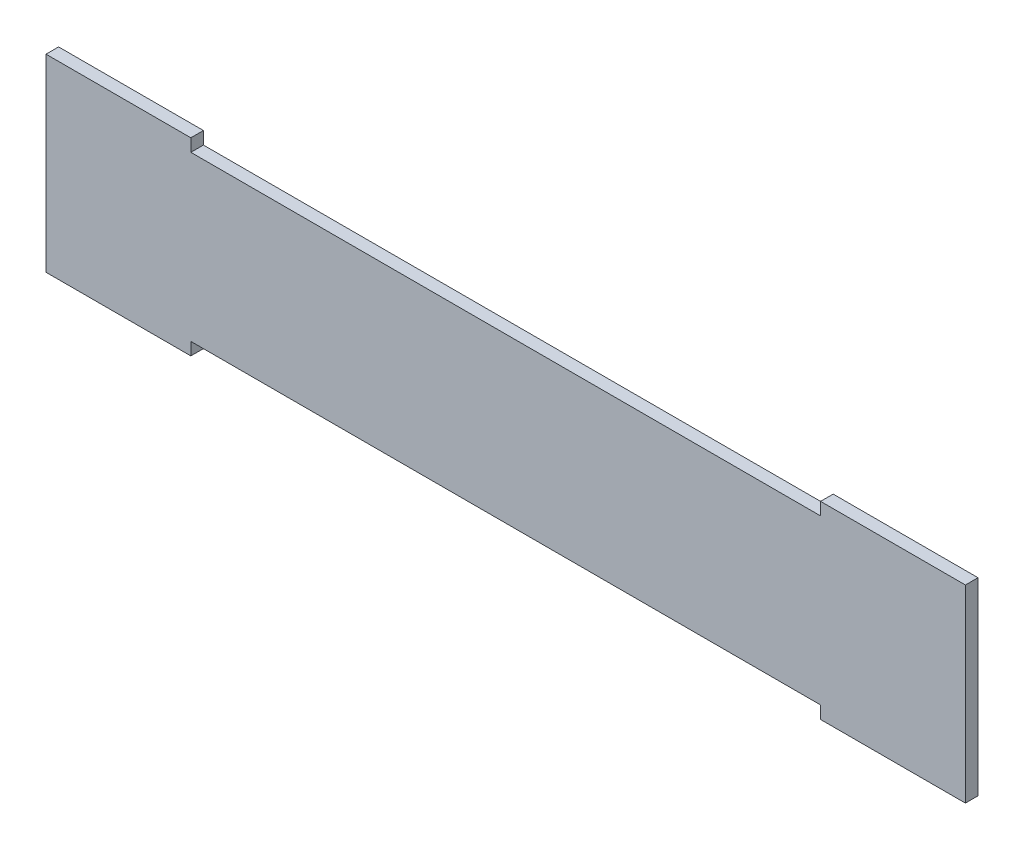
ISO-10303-21;
HEADER;
FILE_DESCRIPTION(('STEP AP214'),'2;1');
FILE_NAME('part.step','',(''),(''),'','','');
FILE_SCHEMA(('AUTOMOTIVE_DESIGN { 1 0 10303 214 1 1 1 1 }'));
ENDSEC;
DATA;
#1=APPLICATION_CONTEXT('core data for automotive mechanical design processes');
#2=APPLICATION_PROTOCOL_DEFINITION('international standard','automotive_design',2000,#1);
#3=PRODUCT_CONTEXT('',#1,'mechanical');
#4=PRODUCT('Part','Part','',(#3));
#5=PRODUCT_RELATED_PRODUCT_CATEGORY('part','',(#4));
#6=PRODUCT_DEFINITION_FORMATION('','',#4);
#7=PRODUCT_DEFINITION_CONTEXT('part definition',#1,'design');
#8=PRODUCT_DEFINITION('design','',#6,#7);
#9=PRODUCT_DEFINITION_SHAPE('','',#8);
#10=(LENGTH_UNIT() NAMED_UNIT(*) SI_UNIT(.MILLI.,.METRE.));
#11=(NAMED_UNIT(*) PLANE_ANGLE_UNIT() SI_UNIT($,.RADIAN.));
#12=(NAMED_UNIT(*) SI_UNIT($,.STERADIAN.) SOLID_ANGLE_UNIT());
#13=UNCERTAINTY_MEASURE_WITH_UNIT(LENGTH_MEASURE(1.E-05),#10,'distance_accuracy_value','');
#14=(GEOMETRIC_REPRESENTATION_CONTEXT(3) GLOBAL_UNCERTAINTY_ASSIGNED_CONTEXT((#13)) GLOBAL_UNIT_ASSIGNED_CONTEXT((#10,
#11,#12)) REPRESENTATION_CONTEXT('',''));
#15=CARTESIAN_POINT('',(0.,0.,0.));
#16=DIRECTION('',(0.,0.,1.));
#17=DIRECTION('',(1.,0.,0.));
#18=AXIS2_PLACEMENT_3D('',#15,#16,#17);
#19=CARTESIAN_POINT('',(0.,0.,2.));
#20=DIRECTION('',(1.,0.,0.));
#21=DIRECTION('',(0.,1.,0.));
#22=AXIS2_PLACEMENT_3D('',#19,#20,#21);
#23=PLANE('',#22);
#24=DIRECTION('',(0.,-1.,0.));
#25=VECTOR('',#24,1.);
#26=CARTESIAN_POINT('',(0.,0.,0.));
#27=LINE('',#26,#25);
#28=CARTESIAN_POINT('',(0.,15.,0.));
#29=VERTEX_POINT('',#28);
#30=CARTESIAN_POINT('',(0.,-15.,0.));
#31=VERTEX_POINT('',#30);
#32=EDGE_CURVE('E136',#29,#31,#27,.T.);
#33=ORIENTED_EDGE('',*,*,#32,.T.);
#34=DIRECTION('',(0.,0.,-1.));
#35=VECTOR('',#34,1.);
#36=CARTESIAN_POINT('',(0.,-15.,2.));
#37=LINE('',#36,#35);
#38=CARTESIAN_POINT('',(0.,-15.,2.));
#39=VERTEX_POINT('',#38);
#40=EDGE_CURVE('E11',#39,#31,#37,.T.);
#41=ORIENTED_EDGE('',*,*,#40,.F.);
#42=DIRECTION('',(0.,-1.,0.));
#43=VECTOR('',#42,1.);
#44=CARTESIAN_POINT('',(0.,0.,2.));
#45=LINE('',#44,#43);
#46=CARTESIAN_POINT('',(0.,15.,2.));
#47=VERTEX_POINT('',#46);
#48=EDGE_CURVE('E94',#47,#39,#45,.T.);
#49=ORIENTED_EDGE('',*,*,#48,.F.);
#50=DIRECTION('',(0.,0.,-1.));
#51=VECTOR('',#50,1.);
#52=CARTESIAN_POINT('',(0.,15.,2.));
#53=LINE('',#52,#51);
#54=EDGE_CURVE('E211',#47,#29,#53,.T.);
#55=ORIENTED_EDGE('',*,*,#54,.T.);
#56=EDGE_LOOP('',(#33,#41,#49,#55));
#57=FACE_BOUND('',#56,.T.);
#58=ADVANCED_FACE('F39',(#57),#23,.F.);
#59=CARTESIAN_POINT('',(0.,-15.,2.));
#60=DIRECTION('',(0.,1.,0.));
#61=DIRECTION('',(0.,0.,1.));
#62=AXIS2_PLACEMENT_3D('',#59,#60,#61);
#63=PLANE('',#62);
#64=DIRECTION('',(1.,0.,0.));
#65=VECTOR('',#64,1.);
#66=CARTESIAN_POINT('',(0.,-15.,0.));
#67=LINE('',#66,#65);
#68=CARTESIAN_POINT('',(23.,-15.,0.));
#69=VERTEX_POINT('',#68);
#70=EDGE_CURVE('E139',#31,#69,#67,.T.);
#71=ORIENTED_EDGE('',*,*,#70,.T.);
#72=DIRECTION('',(0.,0.,-1.));
#73=VECTOR('',#72,1.);
#74=CARTESIAN_POINT('',(23.,-15.,2.));
#75=LINE('',#74,#73);
#76=CARTESIAN_POINT('',(23.,-15.,2.));
#77=VERTEX_POINT('',#76);
#78=EDGE_CURVE('E48',#77,#69,#75,.T.);
#79=ORIENTED_EDGE('',*,*,#78,.F.);
#80=DIRECTION('',(1.,0.,0.));
#81=VECTOR('',#80,1.);
#82=CARTESIAN_POINT('',(0.,-15.,2.));
#83=LINE('',#82,#81);
#84=EDGE_CURVE('E204',#39,#77,#83,.T.);
#85=ORIENTED_EDGE('',*,*,#84,.F.);
#86=ORIENTED_EDGE('',*,*,#40,.T.);
#87=EDGE_LOOP('',(#71,#79,#85,#86));
#88=FACE_BOUND('',#87,.T.);
#89=ADVANCED_FACE('F207',(#88),#63,.F.);
#90=CARTESIAN_POINT('',(23.,-15.,2.));
#91=DIRECTION('',(-1.,0.,0.));
#92=DIRECTION('',(0.,0.,1.));
#93=AXIS2_PLACEMENT_3D('',#90,#91,#92);
#94=PLANE('',#93);
#95=DIRECTION('',(0.,1.,0.));
#96=VECTOR('',#95,1.);
#97=CARTESIAN_POINT('',(23.,-15.,0.));
#98=LINE('',#97,#96);
#99=CARTESIAN_POINT('',(23.,-13.,0.));
#100=VERTEX_POINT('',#99);
#101=EDGE_CURVE('E143',#69,#100,#98,.T.);
#102=ORIENTED_EDGE('',*,*,#101,.T.);
#103=DIRECTION('',(0.,0.,-1.));
#104=VECTOR('',#103,1.);
#105=CARTESIAN_POINT('',(23.,-13.,2.));
#106=LINE('',#105,#104);
#107=CARTESIAN_POINT('',(23.,-13.,2.));
#108=VERTEX_POINT('',#107);
#109=EDGE_CURVE('E122',#108,#100,#106,.T.);
#110=ORIENTED_EDGE('',*,*,#109,.F.);
#111=DIRECTION('',(0.,1.,0.));
#112=VECTOR('',#111,1.);
#113=CARTESIAN_POINT('',(23.,-15.,2.));
#114=LINE('',#113,#112);
#115=EDGE_CURVE('E111',#77,#108,#114,.T.);
#116=ORIENTED_EDGE('',*,*,#115,.F.);
#117=ORIENTED_EDGE('',*,*,#78,.T.);
#118=EDGE_LOOP('',(#102,#110,#116,#117));
#119=FACE_BOUND('',#118,.T.);
#120=ADVANCED_FACE('F166',(#119),#94,.F.);
#121=CARTESIAN_POINT('',(23.,-13.,2.));
#122=DIRECTION('',(0.,1.,0.));
#123=DIRECTION('',(0.,0.,1.));
#124=AXIS2_PLACEMENT_3D('',#121,#122,#123);
#125=PLANE('',#124);
#126=DIRECTION('',(1.,0.,0.));
#127=VECTOR('',#126,1.);
#128=CARTESIAN_POINT('',(23.,-13.,0.));
#129=LINE('',#128,#127);
#130=CARTESIAN_POINT('',(123.,-13.,0.));
#131=VERTEX_POINT('',#130);
#132=EDGE_CURVE('E120',#100,#131,#129,.T.);
#133=ORIENTED_EDGE('',*,*,#132,.T.);
#134=DIRECTION('',(0.,0.,-1.));
#135=VECTOR('',#134,1.);
#136=CARTESIAN_POINT('',(123.,-13.,2.));
#137=LINE('',#136,#135);
#138=CARTESIAN_POINT('',(123.,-13.,2.));
#139=VERTEX_POINT('',#138);
#140=EDGE_CURVE('E117',#139,#131,#137,.T.);
#141=ORIENTED_EDGE('',*,*,#140,.F.);
#142=DIRECTION('',(1.,0.,0.));
#143=VECTOR('',#142,1.);
#144=CARTESIAN_POINT('',(23.,-13.,2.));
#145=LINE('',#144,#143);
#146=EDGE_CURVE('E105',#108,#139,#145,.T.);
#147=ORIENTED_EDGE('',*,*,#146,.F.);
#148=ORIENTED_EDGE('',*,*,#109,.T.);
#149=EDGE_LOOP('',(#133,#141,#147,#148));
#150=FACE_BOUND('',#149,.T.);
#151=ADVANCED_FACE('F118',(#150),#125,.F.);
#152=CARTESIAN_POINT('',(123.,-13.,2.));
#153=DIRECTION('',(1.,0.,0.));
#154=DIRECTION('',(0.,0.,-1.));
#155=AXIS2_PLACEMENT_3D('',#152,#153,#154);
#156=PLANE('',#155);
#157=DIRECTION('',(0.,-1.,0.));
#158=VECTOR('',#157,1.);
#159=CARTESIAN_POINT('',(123.,-13.,0.));
#160=LINE('',#159,#158);
#161=CARTESIAN_POINT('',(123.,-15.,0.));
#162=VERTEX_POINT('',#161);
#163=EDGE_CURVE('E80',#131,#162,#160,.T.);
#164=ORIENTED_EDGE('',*,*,#163,.T.);
#165=DIRECTION('',(0.,0.,-1.));
#166=VECTOR('',#165,1.);
#167=CARTESIAN_POINT('',(123.,-15.,2.));
#168=LINE('',#167,#166);
#169=CARTESIAN_POINT('',(123.,-15.,2.));
#170=VERTEX_POINT('',#169);
#171=EDGE_CURVE('E123',#170,#162,#168,.T.);
#172=ORIENTED_EDGE('',*,*,#171,.F.);
#173=DIRECTION('',(0.,-1.,0.));
#174=VECTOR('',#173,1.);
#175=CARTESIAN_POINT('',(123.,-13.,2.));
#176=LINE('',#175,#174);
#177=EDGE_CURVE('E109',#139,#170,#176,.T.);
#178=ORIENTED_EDGE('',*,*,#177,.F.);
#179=ORIENTED_EDGE('',*,*,#140,.T.);
#180=EDGE_LOOP('',(#164,#172,#178,#179));
#181=FACE_BOUND('',#180,.T.);
#182=ADVANCED_FACE('F125',(#181),#156,.F.);
#183=CARTESIAN_POINT('',(123.,-15.,2.));
#184=DIRECTION('',(0.,1.,0.));
#185=DIRECTION('',(0.,0.,1.));
#186=AXIS2_PLACEMENT_3D('',#183,#184,#185);
#187=PLANE('',#186);
#188=DIRECTION('',(1.,0.,0.));
#189=VECTOR('',#188,1.);
#190=CARTESIAN_POINT('',(123.,-15.,0.));
#191=LINE('',#190,#189);
#192=CARTESIAN_POINT('',(146.,-15.,0.));
#193=VERTEX_POINT('',#192);
#194=EDGE_CURVE('E86',#162,#193,#191,.T.);
#195=ORIENTED_EDGE('',*,*,#194,.T.);
#196=DIRECTION('',(0.,0.,-1.));
#197=VECTOR('',#196,1.);
#198=CARTESIAN_POINT('',(146.,-15.,2.));
#199=LINE('',#198,#197);
#200=CARTESIAN_POINT('',(146.,-15.,2.));
#201=VERTEX_POINT('',#200);
#202=EDGE_CURVE('E135',#201,#193,#199,.T.);
#203=ORIENTED_EDGE('',*,*,#202,.F.);
#204=DIRECTION('',(1.,0.,0.));
#205=VECTOR('',#204,1.);
#206=CARTESIAN_POINT('',(123.,-15.,2.));
#207=LINE('',#206,#205);
#208=EDGE_CURVE('E56',#170,#201,#207,.T.);
#209=ORIENTED_EDGE('',*,*,#208,.F.);
#210=ORIENTED_EDGE('',*,*,#171,.T.);
#211=EDGE_LOOP('',(#195,#203,#209,#210));
#212=FACE_BOUND('',#211,.T.);
#213=ADVANCED_FACE('F312',(#212),#187,.F.);
#214=CARTESIAN_POINT('',(146.,-15.,2.));
#215=DIRECTION('',(-1.,0.,0.));
#216=DIRECTION('',(0.,-1.,0.));
#217=AXIS2_PLACEMENT_3D('',#214,#215,#216);
#218=PLANE('',#217);
#219=DIRECTION('',(0.,1.,0.));
#220=VECTOR('',#219,1.);
#221=CARTESIAN_POINT('',(146.,-15.,0.));
#222=LINE('',#221,#220);
#223=CARTESIAN_POINT('',(146.,15.,0.));
#224=VERTEX_POINT('',#223);
#225=EDGE_CURVE('E152',#193,#224,#222,.T.);
#226=ORIENTED_EDGE('',*,*,#225,.T.);
#227=DIRECTION('',(0.,0.,-1.));
#228=VECTOR('',#227,1.);
#229=CARTESIAN_POINT('',(146.,15.,2.));
#230=LINE('',#229,#228);
#231=CARTESIAN_POINT('',(146.,15.,2.));
#232=VERTEX_POINT('',#231);
#233=EDGE_CURVE('E140',#232,#224,#230,.T.);
#234=ORIENTED_EDGE('',*,*,#233,.F.);
#235=DIRECTION('',(0.,1.,0.));
#236=VECTOR('',#235,1.);
#237=CARTESIAN_POINT('',(146.,-15.,2.));
#238=LINE('',#237,#236);
#239=EDGE_CURVE('E129',#201,#232,#238,.T.);
#240=ORIENTED_EDGE('',*,*,#239,.F.);
#241=ORIENTED_EDGE('',*,*,#202,.T.);
#242=EDGE_LOOP('',(#226,#234,#240,#241));
#243=FACE_BOUND('',#242,.T.);
#244=ADVANCED_FACE('F182',(#243),#218,.F.);
#245=CARTESIAN_POINT('',(0.,0.,2.));
#246=DIRECTION('',(0.,0.,1.));
#247=DIRECTION('',(1.,0.,0.));
#248=AXIS2_PLACEMENT_3D('',#245,#246,#247);
#249=PLANE('',#248);
#250=ORIENTED_EDGE('',*,*,#239,.T.);
#251=DIRECTION('',(1.,0.,0.));
#252=VECTOR('',#251,1.);
#253=CARTESIAN_POINT('',(123.,15.,2.));
#254=LINE('',#253,#252);
#255=CARTESIAN_POINT('',(123.,15.,2.));
#256=VERTEX_POINT('',#255);
#257=EDGE_CURVE('E192',#256,#232,#254,.T.);
#258=ORIENTED_EDGE('',*,*,#257,.F.);
#259=DIRECTION('',(0.,1.,0.));
#260=VECTOR('',#259,1.);
#261=CARTESIAN_POINT('',(123.,13.,2.));
#262=LINE('',#261,#260);
#263=CARTESIAN_POINT('',(123.,13.,2.));
#264=VERTEX_POINT('',#263);
#265=EDGE_CURVE('E247',#264,#256,#262,.T.);
#266=ORIENTED_EDGE('',*,*,#265,.F.);
#267=DIRECTION('',(1.,0.,0.));
#268=VECTOR('',#267,1.);
#269=CARTESIAN_POINT('',(23.,13.,2.));
#270=LINE('',#269,#268);
#271=CARTESIAN_POINT('',(23.,13.,2.));
#272=VERTEX_POINT('',#271);
#273=EDGE_CURVE('E253',#272,#264,#270,.T.);
#274=ORIENTED_EDGE('',*,*,#273,.F.);
#275=DIRECTION('',(0.,-1.,0.));
#276=VECTOR('',#275,1.);
#277=CARTESIAN_POINT('',(23.,15.,2.));
#278=LINE('',#277,#276);
#279=CARTESIAN_POINT('',(23.,15.,2.));
#280=VERTEX_POINT('',#279);
#281=EDGE_CURVE('E256',#280,#272,#278,.T.);
#282=ORIENTED_EDGE('',*,*,#281,.F.);
#283=DIRECTION('',(1.,0.,0.));
#284=VECTOR('',#283,1.);
#285=CARTESIAN_POINT('',(0.,15.,2.));
#286=LINE('',#285,#284);
#287=EDGE_CURVE('E262',#47,#280,#286,.T.);
#288=ORIENTED_EDGE('',*,*,#287,.F.);
#289=ORIENTED_EDGE('',*,*,#48,.T.);
#290=ORIENTED_EDGE('',*,*,#84,.T.);
#291=ORIENTED_EDGE('',*,*,#115,.T.);
#292=ORIENTED_EDGE('',*,*,#146,.T.);
#293=ORIENTED_EDGE('',*,*,#177,.T.);
#294=ORIENTED_EDGE('',*,*,#208,.T.);
#295=EDGE_LOOP('',(#250,#258,#266,#274,#282,#288,#289,#290,#291,#292,#293,#294));
#296=FACE_BOUND('',#295,.T.);
#297=ADVANCED_FACE('F107',(#296),#249,.T.);
#298=CARTESIAN_POINT('',(0.,0.,0.));
#299=DIRECTION('',(0.,0.,1.));
#300=DIRECTION('',(1.,0.,0.));
#301=AXIS2_PLACEMENT_3D('',#298,#299,#300);
#302=PLANE('',#301);
#303=ORIENTED_EDGE('',*,*,#32,.F.);
#304=DIRECTION('',(1.,0.,0.));
#305=VECTOR('',#304,1.);
#306=CARTESIAN_POINT('',(0.,15.,0.));
#307=LINE('',#306,#305);
#308=CARTESIAN_POINT('',(23.,15.,0.));
#309=VERTEX_POINT('',#308);
#310=EDGE_CURVE('E216',#29,#309,#307,.T.);
#311=ORIENTED_EDGE('',*,*,#310,.T.);
#312=DIRECTION('',(0.,-1.,0.));
#313=VECTOR('',#312,1.);
#314=CARTESIAN_POINT('',(23.,15.,0.));
#315=LINE('',#314,#313);
#316=CARTESIAN_POINT('',(23.,13.,0.));
#317=VERTEX_POINT('',#316);
#318=EDGE_CURVE('E274',#309,#317,#315,.T.);
#319=ORIENTED_EDGE('',*,*,#318,.T.);
#320=DIRECTION('',(1.,0.,0.));
#321=VECTOR('',#320,1.);
#322=CARTESIAN_POINT('',(23.,13.,0.));
#323=LINE('',#322,#321);
#324=CARTESIAN_POINT('',(123.,13.,0.));
#325=VERTEX_POINT('',#324);
#326=EDGE_CURVE('E270',#317,#325,#323,.T.);
#327=ORIENTED_EDGE('',*,*,#326,.T.);
#328=DIRECTION('',(0.,1.,0.));
#329=VECTOR('',#328,1.);
#330=CARTESIAN_POINT('',(123.,13.,0.));
#331=LINE('',#330,#329);
#332=CARTESIAN_POINT('',(123.,15.,0.));
#333=VERTEX_POINT('',#332);
#334=EDGE_CURVE('E267',#325,#333,#331,.T.);
#335=ORIENTED_EDGE('',*,*,#334,.T.);
#336=DIRECTION('',(1.,0.,0.));
#337=VECTOR('',#336,1.);
#338=CARTESIAN_POINT('',(123.,15.,0.));
#339=LINE('',#338,#337);
#340=EDGE_CURVE('E178',#333,#224,#339,.T.);
#341=ORIENTED_EDGE('',*,*,#340,.T.);
#342=ORIENTED_EDGE('',*,*,#225,.F.);
#343=ORIENTED_EDGE('',*,*,#194,.F.);
#344=ORIENTED_EDGE('',*,*,#163,.F.);
#345=ORIENTED_EDGE('',*,*,#132,.F.);
#346=ORIENTED_EDGE('',*,*,#101,.F.);
#347=ORIENTED_EDGE('',*,*,#70,.F.);
#348=EDGE_LOOP('',(#303,#311,#319,#327,#335,#341,#342,#343,#344,#345,#346,#347));
#349=FACE_BOUND('',#348,.T.);
#350=ADVANCED_FACE('F172',(#349),#302,.F.);
#351=CARTESIAN_POINT('',(123.,15.,2.));
#352=DIRECTION('',(0.,1.,0.));
#353=DIRECTION('',(-1.,0.,0.));
#354=AXIS2_PLACEMENT_3D('',#351,#352,#353);
#355=PLANE('',#354);
#356=ORIENTED_EDGE('',*,*,#340,.F.);
#357=DIRECTION('',(0.,0.,-1.));
#358=VECTOR('',#357,1.);
#359=CARTESIAN_POINT('',(123.,15.,2.));
#360=LINE('',#359,#358);
#361=EDGE_CURVE('E194',#256,#333,#360,.T.);
#362=ORIENTED_EDGE('',*,*,#361,.F.);
#363=ORIENTED_EDGE('',*,*,#257,.T.);
#364=ORIENTED_EDGE('',*,*,#233,.T.);
#365=EDGE_LOOP('',(#356,#362,#363,#364));
#366=FACE_BOUND('',#365,.T.);
#367=ADVANCED_FACE('F189',(#366),#355,.T.);
#368=CARTESIAN_POINT('',(123.,13.,2.));
#369=DIRECTION('',(-1.,0.,0.));
#370=DIRECTION('',(0.,-1.,0.));
#371=AXIS2_PLACEMENT_3D('',#368,#369,#370);
#372=PLANE('',#371);
#373=ORIENTED_EDGE('',*,*,#334,.F.);
#374=DIRECTION('',(0.,0.,-1.));
#375=VECTOR('',#374,1.);
#376=CARTESIAN_POINT('',(123.,13.,2.));
#377=LINE('',#376,#375);
#378=EDGE_CURVE('E198',#264,#325,#377,.T.);
#379=ORIENTED_EDGE('',*,*,#378,.F.);
#380=ORIENTED_EDGE('',*,*,#265,.T.);
#381=ORIENTED_EDGE('',*,*,#361,.T.);
#382=EDGE_LOOP('',(#373,#379,#380,#381));
#383=FACE_BOUND('',#382,.T.);
#384=ADVANCED_FACE('F251',(#383),#372,.T.);
#385=CARTESIAN_POINT('',(23.,13.,2.));
#386=DIRECTION('',(0.,1.,0.));
#387=DIRECTION('',(-1.,0.,0.));
#388=AXIS2_PLACEMENT_3D('',#385,#386,#387);
#389=PLANE('',#388);
#390=ORIENTED_EDGE('',*,*,#326,.F.);
#391=DIRECTION('',(0.,0.,-1.));
#392=VECTOR('',#391,1.);
#393=CARTESIAN_POINT('',(23.,13.,2.));
#394=LINE('',#393,#392);
#395=EDGE_CURVE('E283',#272,#317,#394,.T.);
#396=ORIENTED_EDGE('',*,*,#395,.F.);
#397=ORIENTED_EDGE('',*,*,#273,.T.);
#398=ORIENTED_EDGE('',*,*,#378,.T.);
#399=EDGE_LOOP('',(#390,#396,#397,#398));
#400=FACE_BOUND('',#399,.T.);
#401=ADVANCED_FACE('F288',(#400),#389,.T.);
#402=CARTESIAN_POINT('',(23.,15.,2.));
#403=DIRECTION('',(1.,0.,0.));
#404=DIRECTION('',(0.,1.,0.));
#405=AXIS2_PLACEMENT_3D('',#402,#403,#404);
#406=PLANE('',#405);
#407=ORIENTED_EDGE('',*,*,#318,.F.);
#408=DIRECTION('',(0.,0.,-1.));
#409=VECTOR('',#408,1.);
#410=CARTESIAN_POINT('',(23.,15.,2.));
#411=LINE('',#410,#409);
#412=EDGE_CURVE('E224',#280,#309,#411,.T.);
#413=ORIENTED_EDGE('',*,*,#412,.F.);
#414=ORIENTED_EDGE('',*,*,#281,.T.);
#415=ORIENTED_EDGE('',*,*,#395,.T.);
#416=EDGE_LOOP('',(#407,#413,#414,#415));
#417=FACE_BOUND('',#416,.T.);
#418=ADVANCED_FACE('F290',(#417),#406,.T.);
#419=CARTESIAN_POINT('',(0.,15.,2.));
#420=DIRECTION('',(0.,1.,0.));
#421=DIRECTION('',(-1.,0.,0.));
#422=AXIS2_PLACEMENT_3D('',#419,#420,#421);
#423=PLANE('',#422);
#424=ORIENTED_EDGE('',*,*,#310,.F.);
#425=ORIENTED_EDGE('',*,*,#54,.F.);
#426=ORIENTED_EDGE('',*,*,#287,.T.);
#427=ORIENTED_EDGE('',*,*,#412,.T.);
#428=EDGE_LOOP('',(#424,#425,#426,#427));
#429=FACE_BOUND('',#428,.T.);
#430=ADVANCED_FACE('F292',(#429),#423,.T.);
#431=CLOSED_SHELL('',(#58,#89,#120,#151,#182,#213,#244,#297,#350,#367,#384,#401,#418,#430));
#432=MANIFOLD_SOLID_BREP('B2',#431);
#433=ADVANCED_BREP_SHAPE_REPRESENTATION('',(#18,#432),#14);
#434=SHAPE_DEFINITION_REPRESENTATION(#9,#433);
ENDSEC;
END-ISO-10303-21;
